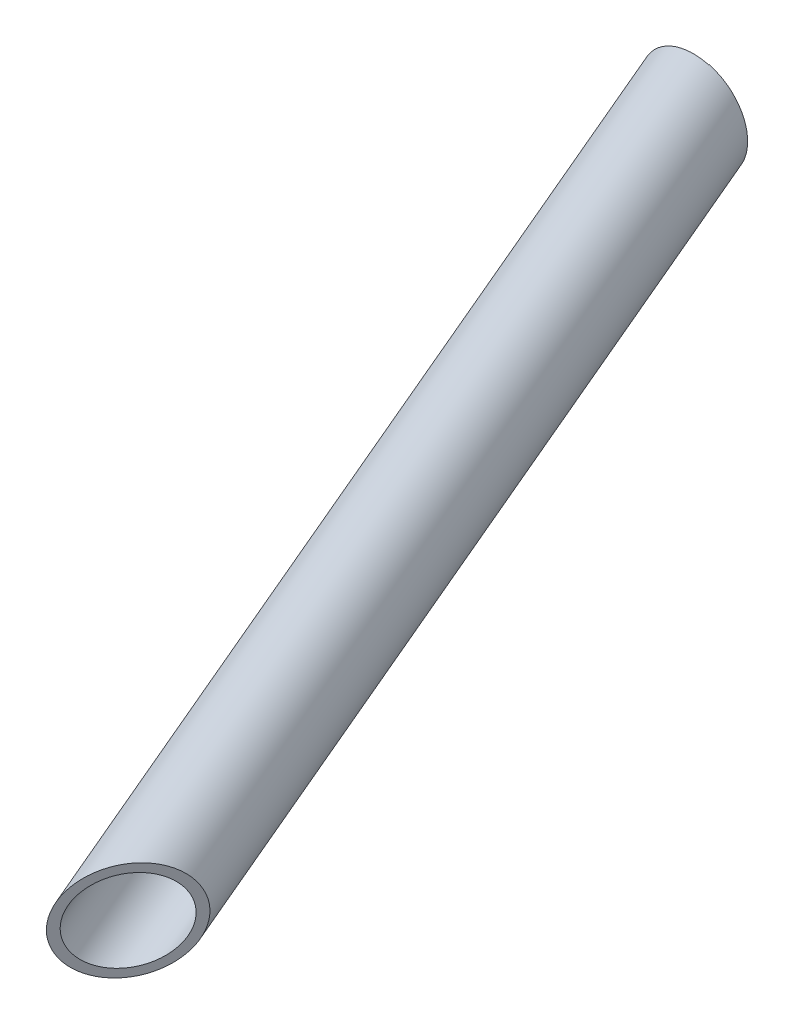
ISO-10303-21;
HEADER;
FILE_DESCRIPTION(('STEP AP214'),'2;1');
FILE_NAME('part.step','',(''),(''),'','','');
FILE_SCHEMA(('AUTOMOTIVE_DESIGN { 1 0 10303 214 1 1 1 1 }'));
ENDSEC;
DATA;
#1=APPLICATION_CONTEXT('core data for automotive mechanical design processes');
#2=APPLICATION_PROTOCOL_DEFINITION('international standard','automotive_design',2000,#1);
#3=PRODUCT_CONTEXT('',#1,'mechanical');
#4=PRODUCT('Part','Part','',(#3));
#5=PRODUCT_RELATED_PRODUCT_CATEGORY('part','',(#4));
#6=PRODUCT_DEFINITION_FORMATION('','',#4);
#7=PRODUCT_DEFINITION_CONTEXT('part definition',#1,'design');
#8=PRODUCT_DEFINITION('design','',#6,#7);
#9=PRODUCT_DEFINITION_SHAPE('','',#8);
#10=(LENGTH_UNIT() NAMED_UNIT(*) SI_UNIT(.MILLI.,.METRE.));
#11=(NAMED_UNIT(*) PLANE_ANGLE_UNIT() SI_UNIT($,.RADIAN.));
#12=(NAMED_UNIT(*) SI_UNIT($,.STERADIAN.) SOLID_ANGLE_UNIT());
#13=UNCERTAINTY_MEASURE_WITH_UNIT(LENGTH_MEASURE(1.E-05),#10,'distance_accuracy_value','');
#14=(GEOMETRIC_REPRESENTATION_CONTEXT(3) GLOBAL_UNCERTAINTY_ASSIGNED_CONTEXT((#13)) GLOBAL_UNIT_ASSIGNED_CONTEXT((#10,
#11,#12)) REPRESENTATION_CONTEXT('',''));
#15=CARTESIAN_POINT('',(0.,0.,0.));
#16=DIRECTION('',(0.,0.,1.));
#17=DIRECTION('',(1.,0.,0.));
#18=AXIS2_PLACEMENT_3D('',#15,#16,#17);
#19=CARTESIAN_POINT('',(-150.,0.,-200.));
#20=DIRECTION('',(0.391140640344852,0.,0.920330918458474));
#21=DIRECTION('',(0.920330918458475,0.,-0.391140640344852));
#22=AXIS2_PLACEMENT_3D('',#19,#20,#21);
#23=CYLINDRICAL_SURFACE('',#22,7.9);
#24=CARTESIAN_POINT('',(-145.733321700332,0.,-189.960756941956));
#25=DIRECTION('',(0.00908676337012188,0.0034075362637957,-0.999952908605234));
#26=DIRECTION('',(0.9999279017278,0.00781928782488758,0.0091131818894493));
#27=AXIS2_PLACEMENT_3D('',#24,#25,#26);
#28=ELLIPSE('',#27,8.61755468254676,7.9);
#29=CARTESIAN_POINT('',(-138.071732025184,-3.60643233113672,-189.903424238614));
#30=VERTEX_POINT('',#29);
#31=CARTESIAN_POINT('',(-147.127731651569,-7.79758004274669,-190.));
#32=VERTEX_POINT('',#31);
#33=EDGE_CURVE('E126',#30,#32,#28,.T.);
#34=ORIENTED_EDGE('',*,*,#33,.T.);
#35=CARTESIAN_POINT('',(-145.75,0.,-190.));
#36=DIRECTION('',(0.,0.,-1.));
#37=DIRECTION('',(1.,0.,0.));
#38=AXIS2_PLACEMENT_3D('',#35,#36,#37);
#39=ELLIPSE('',#38,8.58386895577979,7.9);
#40=CARTESIAN_POINT('',(-152.060201983809,5.35567417656024,-190.));
#41=VERTEX_POINT('',#40);
#42=EDGE_CURVE('E60',#32,#41,#39,.T.);
#43=ORIENTED_EDGE('',*,*,#42,.T.);
#44=CARTESIAN_POINT('',(-142.11438267771,7.17396940893314,-189.903424238614));
#45=VERTEX_POINT('',#44);
#46=EDGE_CURVE('E125',#41,#45,#28,.T.);
#47=ORIENTED_EDGE('',*,*,#46,.T.);
#48=CARTESIAN_POINT('',(-139.573771573539,0.,-175.467697820092));
#49=DIRECTION('',(-0.936285084522112,-0.351106906695792,-0.00970466753338269));
#50=DIRECTION('',(0.0430358521706009,-0.142096139689389,0.988916883521221));
#51=AXIS2_PLACEMENT_3D('',#48,#49,#50);
#52=ELLIPSE('',#51,21.0582067095915,7.9);
#53=CARTESIAN_POINT('',(-142.105343222372,7.15253356872245,-190.));
#54=VERTEX_POINT('',#53);
#55=EDGE_CURVE('E129',#45,#54,#52,.T.);
#56=ORIENTED_EDGE('',*,*,#55,.T.);
#57=CARTESIAN_POINT('',(-145.75,0.,-190.));
#58=DIRECTION('',(0.,0.,-1.));
#59=DIRECTION('',(1.,0.,0.));
#60=AXIS2_PLACEMENT_3D('',#57,#58,#59);
#61=ELLIPSE('',#60,8.58386895577979,7.9);
#62=CARTESIAN_POINT('',(-138.087719578306,-3.56112948211945,-190.));
#63=VERTEX_POINT('',#62);
#64=EDGE_CURVE('E89',#54,#63,#61,.T.);
#65=ORIENTED_EDGE('',*,*,#64,.T.);
#66=EDGE_CURVE('E130',#63,#30,#52,.T.);
#67=ORIENTED_EDGE('',*,*,#66,.T.);
#68=EDGE_LOOP('',(#34,#43,#47,#56,#65,#67));
#69=FACE_BOUND('',#68,.T.);
#70=CARTESIAN_POINT('',(-65.,0.,0.));
#71=DIRECTION('',(0.834008585191079,0.,0.551751465632466));
#72=DIRECTION('',(-0.551751465632466,0.,0.83400858519108));
#73=AXIS2_PLACEMENT_3D('',#70,#71,#72);
#74=ELLIPSE('',#73,9.47232455429705,7.9);
#75=CARTESIAN_POINT('',(-70.2263689557798,0.,7.90000000000001));
#76=VERTEX_POINT('',#75);
#77=EDGE_CURVE('E45',#76,#76,#74,.T.);
#78=ORIENTED_EDGE('',*,*,#77,.T.);
#79=EDGE_LOOP('',(#78));
#80=FACE_BOUND('',#79,.T.);
#81=ADVANCED_FACE('F41',(#69,#80),#23,.F.);
#82=CARTESIAN_POINT('',(-150.,0.,-200.));
#83=DIRECTION('',(0.391140640344852,0.,0.920330918458474));
#84=DIRECTION('',(0.920330918458475,0.,-0.391140640344852));
#85=AXIS2_PLACEMENT_3D('',#82,#83,#84);
#86=CYLINDRICAL_SURFACE('',#85,9.5);
#87=CARTESIAN_POINT('',(-145.75,0.,-190.));
#88=DIRECTION('',(0.,0.,-1.));
#89=DIRECTION('',(1.,0.,0.));
#90=AXIS2_PLACEMENT_3D('',#87,#88,#89);
#91=ELLIPSE('',#90,10.3223740607478,9.5);
#92=CARTESIAN_POINT('',(-146.498707617223,-9.4749774676694,-190.));
#93=VERTEX_POINT('',#92);
#94=CARTESIAN_POINT('',(-152.689226018155,7.03307160148295,-190.));
#95=VERTEX_POINT('',#94);
#96=EDGE_CURVE('E135',#93,#95,#91,.T.);
#97=ORIENTED_EDGE('',*,*,#96,.F.);
#98=CARTESIAN_POINT('',(-145.733321700332,0.,-189.960756941956));
#99=DIRECTION('',(0.00908676337012188,0.0034075362637957,-0.999952908605234));
#100=DIRECTION('',(0.9999279017278,0.00781928782488758,0.0091131818894493));
#101=AXIS2_PLACEMENT_3D('',#98,#99,#100);
#102=ELLIPSE('',#101,10.3628822131891,9.5);
#103=CARTESIAN_POINT('',(-137.339138380588,-5.56001538339157,-189.903424238614));
#104=VERTEX_POINT('',#103);
#105=EDGE_CURVE('E136',#104,#93,#102,.T.);
#106=ORIENTED_EDGE('',*,*,#105,.F.);
#107=CARTESIAN_POINT('',(-139.573771573539,0.,-175.467697820092));
#108=DIRECTION('',(-0.936285084522112,-0.351106906695792,-0.00970466753338269));
#109=DIRECTION('',(0.0430358521706009,-0.142096139689389,0.988916883521221));
#110=AXIS2_PLACEMENT_3D('',#107,#108,#109);
#111=ELLIPSE('',#110,25.3231599672303,9.5);
#112=CARTESIAN_POINT('',(-137.351783951155,-5.52362448785559,-190.));
#113=VERTEX_POINT('',#112);
#114=EDGE_CURVE('E114',#113,#104,#111,.T.);
#115=ORIENTED_EDGE('',*,*,#114,.F.);
#116=CARTESIAN_POINT('',(-145.75,0.,-190.));
#117=DIRECTION('',(0.,0.,-1.));
#118=DIRECTION('',(1.,0.,0.));
#119=AXIS2_PLACEMENT_3D('',#116,#117,#118);
#120=ELLIPSE('',#119,10.3223740607478,9.5);
#121=CARTESIAN_POINT('',(-142.841278849523,9.1150285744586,-190.));
#122=VERTEX_POINT('',#121);
#123=EDGE_CURVE('E101',#122,#113,#120,.T.);
#124=ORIENTED_EDGE('',*,*,#123,.F.);
#125=CARTESIAN_POINT('',(-142.846976322305,9.12755246118799,-189.903424238614));
#126=VERTEX_POINT('',#125);
#127=EDGE_CURVE('E107',#126,#122,#111,.T.);
#128=ORIENTED_EDGE('',*,*,#127,.F.);
#129=EDGE_CURVE('E113',#95,#126,#102,.T.);
#130=ORIENTED_EDGE('',*,*,#129,.F.);
#131=EDGE_LOOP('',(#97,#106,#115,#124,#128,#130));
#132=FACE_BOUND('',#131,.T.);
#133=CARTESIAN_POINT('',(-65.,0.,0.));
#134=DIRECTION('',(0.834008585191079,0.,0.551751465632466));
#135=DIRECTION('',(-0.551751465632466,0.,0.83400858519108));
#136=AXIS2_PLACEMENT_3D('',#133,#134,#135);
#137=ELLIPSE('',#136,11.3907700336483,9.5);
#138=CARTESIAN_POINT('',(-71.2848740607479,0.,9.5));
#139=VERTEX_POINT('',#138);
#140=EDGE_CURVE('E11',#139,#139,#137,.T.);
#141=ORIENTED_EDGE('',*,*,#140,.F.);
#142=EDGE_LOOP('',(#141));
#143=FACE_BOUND('',#142,.T.);
#144=ADVANCED_FACE('F118',(#132,#143),#86,.T.);
#145=CARTESIAN_POINT('',(150.,-10.,-190.));
#146=DIRECTION('',(0.,0.,-1.));
#147=DIRECTION('',(-1.,0.,0.));
#148=AXIS2_PLACEMENT_3D('',#145,#146,#147);
#149=PLANE('',#148);
#150=DIRECTION('',(-0.351123441588392,0.936329177569045,0.));
#151=VECTOR('',#150,1.);
#152=CARTESIAN_POINT('',(-100.453166583322,-103.919937468746,-190.));
#153=LINE('',#152,#151);
#154=EDGE_CURVE('E97',#54,#122,#153,.T.);
#155=ORIENTED_EDGE('',*,*,#154,.T.);
#156=ORIENTED_EDGE('',*,*,#123,.T.);
#157=EDGE_CURVE('E94',#113,#63,#153,.T.);
#158=ORIENTED_EDGE('',*,*,#157,.T.);
#159=ORIENTED_EDGE('',*,*,#64,.F.);
#160=EDGE_LOOP('',(#155,#156,#158,#159));
#161=FACE_BOUND('',#160,.T.);
#162=ADVANCED_FACE('F99',(#161),#149,.T.);
#163=CARTESIAN_POINT('',(-215.72801678848,203.47699370432,-189.903424238614));
#164=DIRECTION('',(-0.936285084522112,-0.351106906695792,-0.00970466753338269));
#165=DIRECTION('',(0.351123441588392,-0.936329177569045,0.));
#166=AXIS2_PLACEMENT_3D('',#163,#164,#165);
#167=PLANE('',#166);
#168=ORIENTED_EDGE('',*,*,#157,.F.);
#169=ORIENTED_EDGE('',*,*,#114,.T.);
#170=DIRECTION('',(0.351123441588392,-0.936329177569044,0.));
#171=VECTOR('',#170,1.);
#172=CARTESIAN_POINT('',(-215.72801678848,203.47699370432,-189.903424238614));
#173=LINE('',#172,#171);
#174=EDGE_CURVE('E137',#30,#104,#173,.T.);
#175=ORIENTED_EDGE('',*,*,#174,.F.);
#176=ORIENTED_EDGE('',*,*,#66,.F.);
#177=EDGE_LOOP('',(#168,#169,#175,#176));
#178=FACE_BOUND('',#177,.T.);
#179=ADVANCED_FACE('F151',(#178),#167,.T.);
#180=EDGE_CURVE('E110',#126,#45,#173,.T.);
#181=ORIENTED_EDGE('',*,*,#180,.F.);
#182=ORIENTED_EDGE('',*,*,#127,.T.);
#183=ORIENTED_EDGE('',*,*,#154,.F.);
#184=ORIENTED_EDGE('',*,*,#55,.F.);
#185=EDGE_LOOP('',(#181,#182,#183,#184));
#186=FACE_BOUND('',#185,.T.);
#187=ADVANCED_FACE('F108',(#186),#167,.T.);
#188=CARTESIAN_POINT('',(-215.72801678848,203.47699370432,-189.903424238614));
#189=DIRECTION('',(0.00908676337012188,0.0034075362637957,-0.999952908605234));
#190=DIRECTION('',(-0.999958714034088,0.,-0.00908681612516445));
#191=AXIS2_PLACEMENT_3D('',#188,#189,#190);
#192=PLANE('',#191);
#193=DIRECTION('',(0.351123441588392,-0.936329177569045,0.));
#194=VECTOR('',#193,1.);
#195=CARTESIAN_POINT('',(-109.771462283922,-107.414298356471,-190.));
#196=LINE('',#195,#194);
#197=EDGE_CURVE('E51',#95,#41,#196,.T.);
#198=ORIENTED_EDGE('',*,*,#197,.F.);
#199=ORIENTED_EDGE('',*,*,#129,.T.);
#200=ORIENTED_EDGE('',*,*,#180,.T.);
#201=ORIENTED_EDGE('',*,*,#46,.F.);
#202=EDGE_LOOP('',(#198,#199,#200,#201));
#203=FACE_BOUND('',#202,.T.);
#204=ADVANCED_FACE('F158',(#203),#192,.T.);
#205=ORIENTED_EDGE('',*,*,#174,.T.);
#206=ORIENTED_EDGE('',*,*,#105,.T.);
#207=EDGE_CURVE('E134',#32,#93,#196,.T.);
#208=ORIENTED_EDGE('',*,*,#207,.F.);
#209=ORIENTED_EDGE('',*,*,#33,.F.);
#210=EDGE_LOOP('',(#205,#206,#208,#209));
#211=FACE_BOUND('',#210,.T.);
#212=ADVANCED_FACE('F149',(#211),#192,.T.);
#213=ORIENTED_EDGE('',*,*,#207,.T.);
#214=ORIENTED_EDGE('',*,*,#96,.T.);
#215=ORIENTED_EDGE('',*,*,#197,.T.);
#216=ORIENTED_EDGE('',*,*,#42,.F.);
#217=EDGE_LOOP('',(#213,#214,#215,#216));
#218=FACE_BOUND('',#217,.T.);
#219=ADVANCED_FACE('F145',(#218),#149,.T.);
#220=CARTESIAN_POINT('',(-65.,0.,0.));
#221=DIRECTION('',(0.834008585191079,0.,0.551751465632466));
#222=DIRECTION('',(0.551751465632466,0.,-0.83400858519108));
#223=AXIS2_PLACEMENT_3D('',#220,#221,#222);
#224=PLANE('',#223);
#225=ORIENTED_EDGE('',*,*,#77,.F.);
#226=EDGE_LOOP('',(#225));
#227=FACE_BOUND('',#226,.T.);
#228=ORIENTED_EDGE('',*,*,#140,.T.);
#229=EDGE_LOOP('',(#228));
#230=FACE_BOUND('',#229,.T.);
#231=ADVANCED_FACE('F43',(#227,#230),#224,.T.);
#232=CLOSED_SHELL('',(#81,#144,#162,#179,#187,#204,#212,#219,#231));
#233=MANIFOLD_SOLID_BREP('B2',#232);
#234=ADVANCED_BREP_SHAPE_REPRESENTATION('',(#18,#233),#14);
#235=SHAPE_DEFINITION_REPRESENTATION(#9,#234);
ENDSEC;
END-ISO-10303-21;
